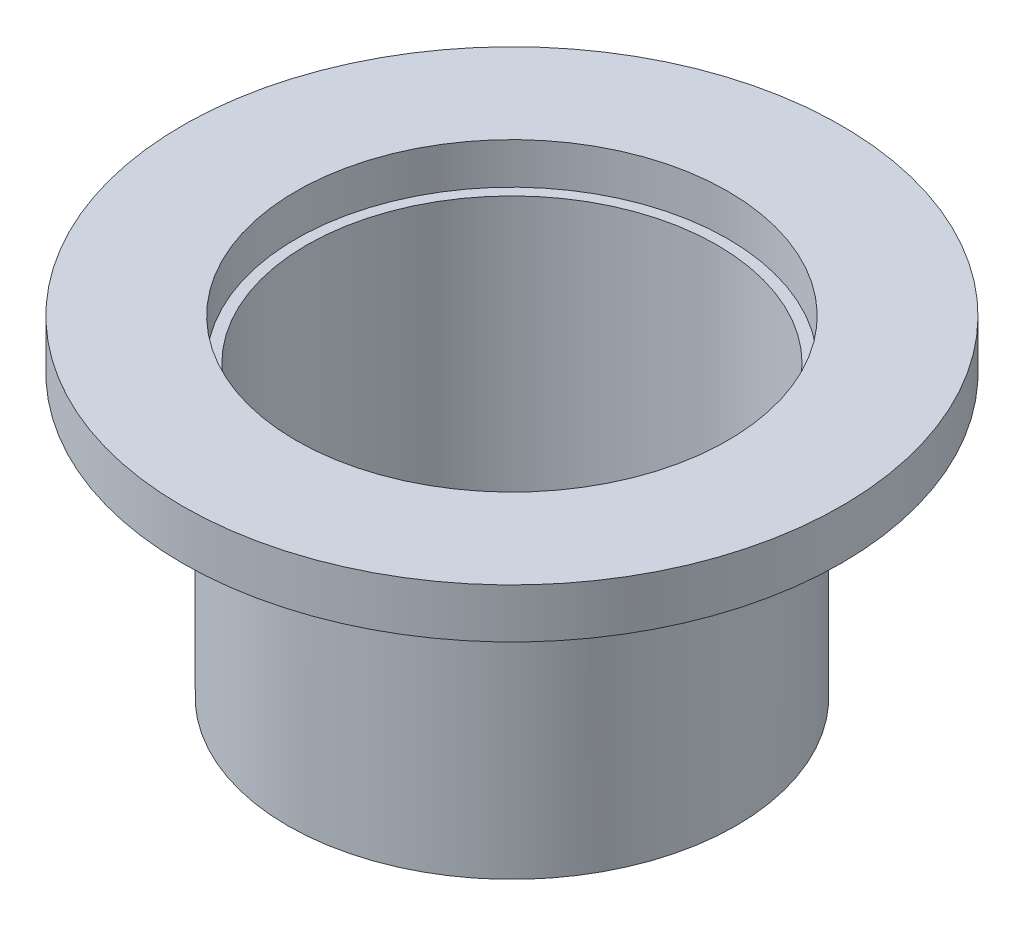
ISO-10303-21;
HEADER;
FILE_DESCRIPTION(('STEP AP214'),'2;1');
FILE_NAME('part.step','',(''),(''),'','','');
FILE_SCHEMA(('AUTOMOTIVE_DESIGN { 1 0 10303 214 1 1 1 1 }'));
ENDSEC;
DATA;
#1=APPLICATION_CONTEXT('core data for automotive mechanical design processes');
#2=APPLICATION_PROTOCOL_DEFINITION('international standard','automotive_design',2000,#1);
#3=PRODUCT_CONTEXT('',#1,'mechanical');
#4=PRODUCT('Part','Part','',(#3));
#5=PRODUCT_RELATED_PRODUCT_CATEGORY('part','',(#4));
#6=PRODUCT_DEFINITION_FORMATION('','',#4);
#7=PRODUCT_DEFINITION_CONTEXT('part definition',#1,'design');
#8=PRODUCT_DEFINITION('design','',#6,#7);
#9=PRODUCT_DEFINITION_SHAPE('','',#8);
#10=(LENGTH_UNIT() NAMED_UNIT(*) SI_UNIT(.MILLI.,.METRE.));
#11=(NAMED_UNIT(*) PLANE_ANGLE_UNIT() SI_UNIT($,.RADIAN.));
#12=(NAMED_UNIT(*) SI_UNIT($,.STERADIAN.) SOLID_ANGLE_UNIT());
#13=UNCERTAINTY_MEASURE_WITH_UNIT(LENGTH_MEASURE(1.E-05),#10,'distance_accuracy_value','');
#14=(GEOMETRIC_REPRESENTATION_CONTEXT(3) GLOBAL_UNCERTAINTY_ASSIGNED_CONTEXT((#13)) GLOBAL_UNIT_ASSIGNED_CONTEXT((#10,
#11,#12)) REPRESENTATION_CONTEXT('',''));
#15=CARTESIAN_POINT('',(0.,0.,0.));
#16=DIRECTION('',(0.,0.,1.));
#17=DIRECTION('',(1.,0.,0.));
#18=AXIS2_PLACEMENT_3D('',#15,#16,#17);
#19=CARTESIAN_POINT('',(0.,20.,0.));
#20=DIRECTION('',(0.,-1.,0.));
#21=DIRECTION('',(0.,0.,-1.));
#22=AXIS2_PLACEMENT_3D('',#19,#20,#21);
#23=CYLINDRICAL_SURFACE('',#22,13.6);
#24=CARTESIAN_POINT('',(0.,0.,0.));
#25=DIRECTION('',(0.,1.,0.));
#26=DIRECTION('',(0.,0.,1.));
#27=AXIS2_PLACEMENT_3D('',#24,#25,#26);
#28=CIRCLE('',#27,13.6);
#29=CARTESIAN_POINT('',(0.,0.,13.6));
#30=VERTEX_POINT('',#29);
#31=EDGE_CURVE('E10',#30,#30,#28,.T.);
#32=ORIENTED_EDGE('',*,*,#31,.T.);
#33=EDGE_LOOP('',(#32));
#34=FACE_BOUND('',#33,.T.);
#35=CARTESIAN_POINT('',(0.,15.,0.));
#36=DIRECTION('',(0.,-1.,0.));
#37=DIRECTION('',(0.,0.,-1.));
#38=AXIS2_PLACEMENT_3D('',#35,#36,#37);
#39=CIRCLE('',#38,13.6);
#40=CARTESIAN_POINT('',(0.,15.,-13.6));
#41=VERTEX_POINT('',#40);
#42=EDGE_CURVE('E56',#41,#41,#39,.T.);
#43=ORIENTED_EDGE('',*,*,#42,.T.);
#44=EDGE_LOOP('',(#43));
#45=FACE_BOUND('',#44,.T.);
#46=ADVANCED_FACE('F34',(#34,#45),#23,.T.);
#47=CARTESIAN_POINT('',(0.,20.,0.));
#48=DIRECTION('',(0.,-1.,0.));
#49=DIRECTION('',(0.,0.,-1.));
#50=AXIS2_PLACEMENT_3D('',#47,#48,#49);
#51=CYLINDRICAL_SURFACE('',#50,12.45);
#52=CARTESIAN_POINT('',(0.,0.,0.));
#53=DIRECTION('',(0.,1.,0.));
#54=DIRECTION('',(0.,0.,1.));
#55=AXIS2_PLACEMENT_3D('',#52,#53,#54);
#56=CIRCLE('',#55,12.45);
#57=CARTESIAN_POINT('',(0.,0.,12.45));
#58=VERTEX_POINT('',#57);
#59=EDGE_CURVE('E41',#58,#58,#56,.T.);
#60=ORIENTED_EDGE('',*,*,#59,.F.);
#61=EDGE_LOOP('',(#60));
#62=FACE_BOUND('',#61,.T.);
#63=CARTESIAN_POINT('',(0.,17.5,0.));
#64=DIRECTION('',(0.,1.,0.));
#65=DIRECTION('',(0.,0.,1.));
#66=AXIS2_PLACEMENT_3D('',#63,#64,#65);
#67=CIRCLE('',#66,12.45);
#68=CARTESIAN_POINT('',(0.,17.5,12.45));
#69=VERTEX_POINT('',#68);
#70=EDGE_CURVE('E37',#69,#69,#67,.T.);
#71=ORIENTED_EDGE('',*,*,#70,.T.);
#72=EDGE_LOOP('',(#71));
#73=FACE_BOUND('',#72,.T.);
#74=ADVANCED_FACE('F86',(#62,#73),#51,.F.);
#75=CARTESIAN_POINT('',(0.,0.,0.));
#76=DIRECTION('',(0.,1.,0.));
#77=DIRECTION('',(0.,0.,1.));
#78=AXIS2_PLACEMENT_3D('',#75,#76,#77);
#79=PLANE('',#78);
#80=ORIENTED_EDGE('',*,*,#31,.F.);
#81=EDGE_LOOP('',(#80));
#82=FACE_BOUND('',#81,.T.);
#83=ORIENTED_EDGE('',*,*,#59,.T.);
#84=EDGE_LOOP('',(#83));
#85=FACE_BOUND('',#84,.T.);
#86=ADVANCED_FACE('F69',(#82,#85),#79,.F.);
#87=CARTESIAN_POINT('',(0.,15.,0.));
#88=DIRECTION('',(0.,1.,0.));
#89=DIRECTION('',(0.,0.,1.));
#90=AXIS2_PLACEMENT_3D('',#87,#88,#89);
#91=CYLINDRICAL_SURFACE('',#90,20.);
#92=CARTESIAN_POINT('',(0.,17.,0.));
#93=DIRECTION('',(0.,-1.,0.));
#94=DIRECTION('',(0.,0.,-1.));
#95=AXIS2_PLACEMENT_3D('',#92,#93,#94);
#96=CIRCLE('',#95,20.);
#97=CARTESIAN_POINT('',(0.,17.,-20.));
#98=VERTEX_POINT('',#97);
#99=EDGE_CURVE('E59',#98,#98,#96,.T.);
#100=ORIENTED_EDGE('',*,*,#99,.F.);
#101=EDGE_LOOP('',(#100));
#102=FACE_BOUND('',#101,.T.);
#103=CARTESIAN_POINT('',(0.,20.,0.));
#104=DIRECTION('',(0.,1.,0.));
#105=DIRECTION('',(0.,0.,1.));
#106=AXIS2_PLACEMENT_3D('',#103,#104,#105);
#107=CIRCLE('',#106,20.);
#108=CARTESIAN_POINT('',(0.,20.,20.));
#109=VERTEX_POINT('',#108);
#110=EDGE_CURVE('E45',#109,#109,#107,.T.);
#111=ORIENTED_EDGE('',*,*,#110,.F.);
#112=EDGE_LOOP('',(#111));
#113=FACE_BOUND('',#112,.T.);
#114=ADVANCED_FACE('F65',(#102,#113),#91,.T.);
#115=CARTESIAN_POINT('',(0.,20.,0.));
#116=DIRECTION('',(0.,1.,0.));
#117=DIRECTION('',(0.,0.,1.));
#118=AXIS2_PLACEMENT_3D('',#115,#116,#117);
#119=PLANE('',#118);
#120=CARTESIAN_POINT('',(0.,20.,0.));
#121=DIRECTION('',(0.,1.,0.));
#122=DIRECTION('',(0.,0.,1.));
#123=AXIS2_PLACEMENT_3D('',#120,#121,#122);
#124=CIRCLE('',#123,13.1);
#125=CARTESIAN_POINT('',(0.,20.,13.1));
#126=VERTEX_POINT('',#125);
#127=EDGE_CURVE('E51',#126,#126,#124,.T.);
#128=ORIENTED_EDGE('',*,*,#127,.F.);
#129=EDGE_LOOP('',(#128));
#130=FACE_BOUND('',#129,.T.);
#131=ORIENTED_EDGE('',*,*,#110,.T.);
#132=EDGE_LOOP('',(#131));
#133=FACE_BOUND('',#132,.T.);
#134=ADVANCED_FACE('F68',(#130,#133),#119,.T.);
#135=CARTESIAN_POINT('',(0.,17.5,0.));
#136=DIRECTION('',(0.,1.,0.));
#137=DIRECTION('',(0.,0.,1.));
#138=AXIS2_PLACEMENT_3D('',#135,#136,#137);
#139=CYLINDRICAL_SURFACE('',#138,13.1);
#140=CARTESIAN_POINT('',(0.,17.5,0.));
#141=DIRECTION('',(0.,1.,0.));
#142=DIRECTION('',(0.,0.,1.));
#143=AXIS2_PLACEMENT_3D('',#140,#141,#142);
#144=CIRCLE('',#143,13.1);
#145=CARTESIAN_POINT('',(0.,17.5,13.1));
#146=VERTEX_POINT('',#145);
#147=EDGE_CURVE('E50',#146,#146,#144,.T.);
#148=ORIENTED_EDGE('',*,*,#147,.F.);
#149=EDGE_LOOP('',(#148));
#150=FACE_BOUND('',#149,.T.);
#151=ORIENTED_EDGE('',*,*,#127,.T.);
#152=EDGE_LOOP('',(#151));
#153=FACE_BOUND('',#152,.T.);
#154=ADVANCED_FACE('F74',(#150,#153),#139,.F.);
#155=CARTESIAN_POINT('',(0.,17.5,0.));
#156=DIRECTION('',(0.,1.,0.));
#157=DIRECTION('',(0.,0.,1.));
#158=AXIS2_PLACEMENT_3D('',#155,#156,#157);
#159=PLANE('',#158);
#160=ORIENTED_EDGE('',*,*,#70,.F.);
#161=EDGE_LOOP('',(#160));
#162=FACE_BOUND('',#161,.T.);
#163=ORIENTED_EDGE('',*,*,#147,.T.);
#164=EDGE_LOOP('',(#163));
#165=FACE_BOUND('',#164,.T.);
#166=ADVANCED_FACE('F80',(#162,#165),#159,.T.);
#167=CARTESIAN_POINT('',(0.,17.,0.));
#168=DIRECTION('',(0.,1.,0.));
#169=DIRECTION('',(0.,0.,1.));
#170=AXIS2_PLACEMENT_3D('',#167,#168,#169);
#171=CONICAL_SURFACE('',#170,20.,1.26791145841992);
#172=ORIENTED_EDGE('',*,*,#42,.F.);
#173=EDGE_LOOP('',(#172));
#174=FACE_BOUND('',#173,.T.);
#175=ORIENTED_EDGE('',*,*,#99,.T.);
#176=EDGE_LOOP('',(#175));
#177=FACE_BOUND('',#176,.T.);
#178=ADVANCED_FACE('F63',(#174,#177),#171,.T.);
#179=CLOSED_SHELL('',(#46,#74,#86,#114,#134,#154,#166,#178));
#180=MANIFOLD_SOLID_BREP('B2',#179);
#181=ADVANCED_BREP_SHAPE_REPRESENTATION('',(#18,#180),#14);
#182=SHAPE_DEFINITION_REPRESENTATION(#9,#181);
ENDSEC;
END-ISO-10303-21;
